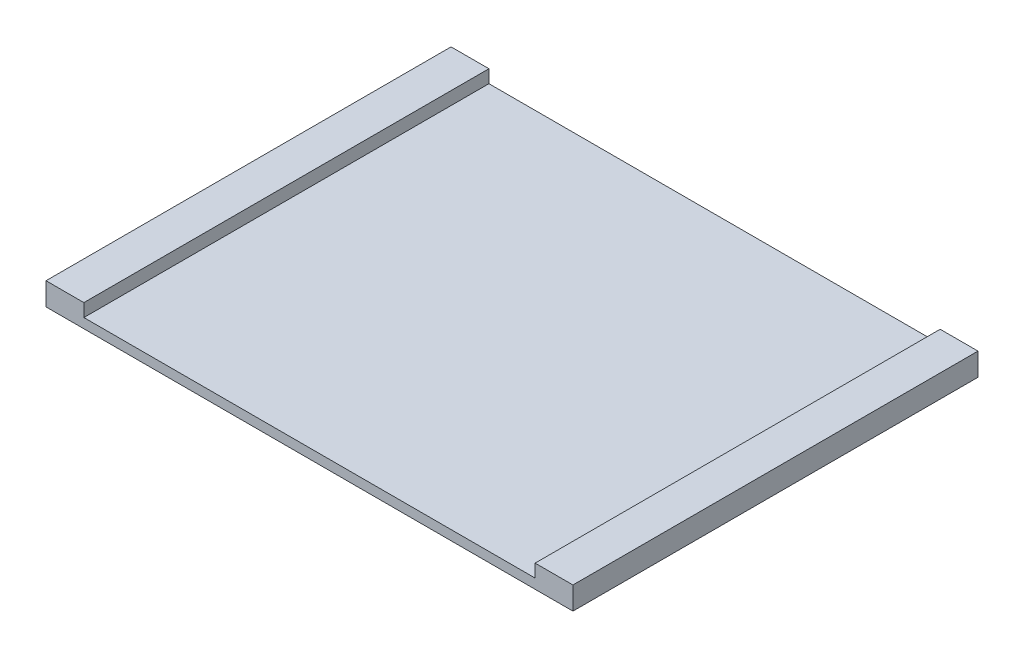
ISO-10303-21;
HEADER;
FILE_DESCRIPTION(('STEP AP214'),'2;1');
FILE_NAME('part.step','',(''),(''),'','','');
FILE_SCHEMA(('AUTOMOTIVE_DESIGN { 1 0 10303 214 1 1 1 1 }'));
ENDSEC;
DATA;
#1=APPLICATION_CONTEXT('core data for automotive mechanical design processes');
#2=APPLICATION_PROTOCOL_DEFINITION('international standard','automotive_design',2000,#1);
#3=PRODUCT_CONTEXT('',#1,'mechanical');
#4=PRODUCT('Part','Part','',(#3));
#5=PRODUCT_RELATED_PRODUCT_CATEGORY('part','',(#4));
#6=PRODUCT_DEFINITION_FORMATION('','',#4);
#7=PRODUCT_DEFINITION_CONTEXT('part definition',#1,'design');
#8=PRODUCT_DEFINITION('design','',#6,#7);
#9=PRODUCT_DEFINITION_SHAPE('','',#8);
#10=(LENGTH_UNIT() NAMED_UNIT(*) SI_UNIT(.MILLI.,.METRE.));
#11=(NAMED_UNIT(*) PLANE_ANGLE_UNIT() SI_UNIT($,.RADIAN.));
#12=(NAMED_UNIT(*) SI_UNIT($,.STERADIAN.) SOLID_ANGLE_UNIT());
#13=UNCERTAINTY_MEASURE_WITH_UNIT(LENGTH_MEASURE(1.E-05),#10,'distance_accuracy_value','');
#14=(GEOMETRIC_REPRESENTATION_CONTEXT(3) GLOBAL_UNCERTAINTY_ASSIGNED_CONTEXT((#13)) GLOBAL_UNIT_ASSIGNED_CONTEXT((#10,
#11,#12)) REPRESENTATION_CONTEXT('',''));
#15=CARTESIAN_POINT('',(0.,0.,0.));
#16=DIRECTION('',(0.,0.,1.));
#17=DIRECTION('',(1.,0.,0.));
#18=AXIS2_PLACEMENT_3D('',#15,#16,#17);
#19=CARTESIAN_POINT('',(0.,4.,0.));
#20=DIRECTION('',(1.,0.,0.));
#21=DIRECTION('',(0.,0.,-1.));
#22=AXIS2_PLACEMENT_3D('',#19,#20,#21);
#23=PLANE('',#22);
#24=DIRECTION('',(0.,0.,1.));
#25=VECTOR('',#24,1.);
#26=CARTESIAN_POINT('',(0.,0.,0.));
#27=LINE('',#26,#25);
#28=CARTESIAN_POINT('',(0.,0.,-50.8));
#29=VERTEX_POINT('',#28);
#30=CARTESIAN_POINT('',(0.,0.,0.));
#31=VERTEX_POINT('',#30);
#32=EDGE_CURVE('E186',#29,#31,#27,.T.);
#33=ORIENTED_EDGE('',*,*,#32,.T.);
#34=DIRECTION('',(0.,-1.,0.));
#35=VECTOR('',#34,1.);
#36=CARTESIAN_POINT('',(0.,4.,0.));
#37=LINE('',#36,#35);
#38=CARTESIAN_POINT('',(0.,4.,0.));
#39=VERTEX_POINT('',#38);
#40=EDGE_CURVE('E216',#39,#31,#37,.T.);
#41=ORIENTED_EDGE('',*,*,#40,.F.);
#42=DIRECTION('',(0.,0.,1.));
#43=VECTOR('',#42,1.);
#44=CARTESIAN_POINT('',(0.,4.,0.));
#45=LINE('',#44,#43);
#46=CARTESIAN_POINT('',(0.,4.,-50.8));
#47=VERTEX_POINT('',#46);
#48=EDGE_CURVE('E187',#47,#39,#45,.T.);
#49=ORIENTED_EDGE('',*,*,#48,.F.);
#50=DIRECTION('',(0.,-1.,0.));
#51=VECTOR('',#50,1.);
#52=CARTESIAN_POINT('',(0.,4.,-50.8));
#53=LINE('',#52,#51);
#54=EDGE_CURVE('E200',#47,#29,#53,.T.);
#55=ORIENTED_EDGE('',*,*,#54,.T.);
#56=EDGE_LOOP('',(#33,#41,#49,#55));
#57=FACE_BOUND('',#56,.T.);
#58=ADVANCED_FACE('F33',(#57),#23,.F.);
#59=CARTESIAN_POINT('',(0.,4.,0.));
#60=DIRECTION('',(0.,0.,-1.));
#61=DIRECTION('',(-1.,0.,0.));
#62=AXIS2_PLACEMENT_3D('',#59,#60,#61);
#63=PLANE('',#62);
#64=DIRECTION('',(1.,0.,0.));
#65=VECTOR('',#64,1.);
#66=CARTESIAN_POINT('',(0.,0.,0.));
#67=LINE('',#66,#65);
#68=CARTESIAN_POINT('',(69.596,0.,0.));
#69=VERTEX_POINT('',#68);
#70=EDGE_CURVE('E203',#31,#69,#67,.T.);
#71=ORIENTED_EDGE('',*,*,#70,.T.);
#72=DIRECTION('',(0.,-1.,0.));
#73=VECTOR('',#72,1.);
#74=CARTESIAN_POINT('',(69.596,4.,0.));
#75=LINE('',#74,#73);
#76=CARTESIAN_POINT('',(69.596,4.,0.));
#77=VERTEX_POINT('',#76);
#78=EDGE_CURVE('E213',#77,#69,#75,.T.);
#79=ORIENTED_EDGE('',*,*,#78,.F.);
#80=DIRECTION('',(1.,0.,0.));
#81=VECTOR('',#80,1.);
#82=CARTESIAN_POINT('',(0.,4.,0.));
#83=LINE('',#82,#81);
#84=EDGE_CURVE('E190',#39,#77,#83,.T.);
#85=ORIENTED_EDGE('',*,*,#84,.F.);
#86=ORIENTED_EDGE('',*,*,#40,.T.);
#87=EDGE_LOOP('',(#71,#79,#85,#86));
#88=FACE_BOUND('',#87,.T.);
#89=ADVANCED_FACE('F252',(#88),#63,.F.);
#90=CARTESIAN_POINT('',(69.596,4.,0.));
#91=DIRECTION('',(-1.,0.,0.));
#92=DIRECTION('',(0.,0.,1.));
#93=AXIS2_PLACEMENT_3D('',#90,#91,#92);
#94=PLANE('',#93);
#95=DIRECTION('',(0.,0.,-1.));
#96=VECTOR('',#95,1.);
#97=CARTESIAN_POINT('',(69.596,0.,0.));
#98=LINE('',#97,#96);
#99=CARTESIAN_POINT('',(69.596,0.,-50.8));
#100=VERTEX_POINT('',#99);
#101=EDGE_CURVE('E205',#69,#100,#98,.T.);
#102=ORIENTED_EDGE('',*,*,#101,.T.);
#103=DIRECTION('',(0.,-1.,0.));
#104=VECTOR('',#103,1.);
#105=CARTESIAN_POINT('',(69.596,4.,-50.8));
#106=LINE('',#105,#104);
#107=CARTESIAN_POINT('',(69.596,4.,-50.8));
#108=VERTEX_POINT('',#107);
#109=EDGE_CURVE('E210',#108,#100,#106,.T.);
#110=ORIENTED_EDGE('',*,*,#109,.F.);
#111=DIRECTION('',(0.,0.,-1.));
#112=VECTOR('',#111,1.);
#113=CARTESIAN_POINT('',(69.596,4.,0.));
#114=LINE('',#113,#112);
#115=EDGE_CURVE('E194',#77,#108,#114,.T.);
#116=ORIENTED_EDGE('',*,*,#115,.F.);
#117=ORIENTED_EDGE('',*,*,#78,.T.);
#118=EDGE_LOOP('',(#102,#110,#116,#117));
#119=FACE_BOUND('',#118,.T.);
#120=ADVANCED_FACE('F257',(#119),#94,.F.);
#121=CARTESIAN_POINT('',(0.,4.,-50.8));
#122=DIRECTION('',(0.,0.,1.));
#123=DIRECTION('',(1.,0.,0.));
#124=AXIS2_PLACEMENT_3D('',#121,#122,#123);
#125=PLANE('',#124);
#126=DIRECTION('',(-1.,0.,0.));
#127=VECTOR('',#126,1.);
#128=CARTESIAN_POINT('',(0.,0.,-50.8));
#129=LINE('',#128,#127);
#130=EDGE_CURVE('E191',#100,#29,#129,.T.);
#131=ORIENTED_EDGE('',*,*,#130,.T.);
#132=ORIENTED_EDGE('',*,*,#54,.F.);
#133=DIRECTION('',(-1.,0.,0.));
#134=VECTOR('',#133,1.);
#135=CARTESIAN_POINT('',(0.,4.,-50.8));
#136=LINE('',#135,#134);
#137=EDGE_CURVE('E197',#108,#47,#136,.T.);
#138=ORIENTED_EDGE('',*,*,#137,.F.);
#139=ORIENTED_EDGE('',*,*,#109,.T.);
#140=EDGE_LOOP('',(#131,#132,#138,#139));
#141=FACE_BOUND('',#140,.T.);
#142=ADVANCED_FACE('F246',(#141),#125,.F.);
#143=CARTESIAN_POINT('',(0.,0.,0.));
#144=DIRECTION('',(0.,-1.,0.));
#145=DIRECTION('',(0.,0.,-1.));
#146=AXIS2_PLACEMENT_3D('',#143,#144,#145);
#147=PLANE('',#146);
#148=ORIENTED_EDGE('',*,*,#32,.F.);
#149=ORIENTED_EDGE('',*,*,#130,.F.);
#150=ORIENTED_EDGE('',*,*,#101,.F.);
#151=ORIENTED_EDGE('',*,*,#70,.F.);
#152=EDGE_LOOP('',(#148,#149,#150,#151));
#153=FACE_BOUND('',#152,.T.);
#154=ADVANCED_FACE('F238',(#153),#147,.T.);
#155=CARTESIAN_POINT('',(0.,4.,0.));
#156=DIRECTION('',(0.,1.,0.));
#157=DIRECTION('',(0.,0.,1.));
#158=AXIS2_PLACEMENT_3D('',#155,#156,#157);
#159=PLANE('',#158);
#160=ORIENTED_EDGE('',*,*,#48,.T.);
#161=ORIENTED_EDGE('',*,*,#84,.T.);
#162=ORIENTED_EDGE('',*,*,#115,.T.);
#163=ORIENTED_EDGE('',*,*,#137,.T.);
#164=EDGE_LOOP('',(#160,#161,#162,#163));
#165=FACE_BOUND('',#164,.T.);
#166=DIRECTION('',(0.,0.,1.));
#167=VECTOR('',#166,1.);
#168=CARTESIAN_POINT('',(-5.84200000000001,4.,-56.638));
#169=LINE('',#168,#167);
#170=CARTESIAN_POINT('',(-5.84200000000001,4.,-56.638));
#171=VERTEX_POINT('',#170);
#172=CARTESIAN_POINT('',(-5.842,4.,5.842));
#173=VERTEX_POINT('',#172);
#174=EDGE_CURVE('E168',#171,#173,#169,.T.);
#175=ORIENTED_EDGE('',*,*,#174,.F.);
#176=DIRECTION('',(-1.,0.,0.));
#177=VECTOR('',#176,1.);
#178=CARTESIAN_POINT('',(-5.84200000000001,4.,-56.638));
#179=LINE('',#178,#177);
#180=CARTESIAN_POINT('',(75.438,4.,-56.638));
#181=VERTEX_POINT('',#180);
#182=EDGE_CURVE('E173',#181,#171,#179,.T.);
#183=ORIENTED_EDGE('',*,*,#182,.F.);
#184=DIRECTION('',(0.,0.,-1.));
#185=VECTOR('',#184,1.);
#186=CARTESIAN_POINT('',(75.438,4.,-56.638));
#187=LINE('',#186,#185);
#188=CARTESIAN_POINT('',(75.438,4.,5.842));
#189=VERTEX_POINT('',#188);
#190=EDGE_CURVE('E179',#189,#181,#187,.T.);
#191=ORIENTED_EDGE('',*,*,#190,.F.);
#192=DIRECTION('',(1.,0.,0.));
#193=VECTOR('',#192,1.);
#194=CARTESIAN_POINT('',(-5.842,4.,5.842));
#195=LINE('',#194,#193);
#196=EDGE_CURVE('E123',#173,#189,#195,.T.);
#197=ORIENTED_EDGE('',*,*,#196,.F.);
#198=EDGE_LOOP('',(#175,#183,#191,#197));
#199=FACE_BOUND('',#198,.T.);
#200=ADVANCED_FACE('F236',(#165,#199),#159,.F.);
#201=CARTESIAN_POINT('',(-5.84200000000001,5.5,-56.638));
#202=DIRECTION('',(1.,0.,0.));
#203=DIRECTION('',(0.,0.,-1.));
#204=AXIS2_PLACEMENT_3D('',#201,#202,#203);
#205=PLANE('',#204);
#206=ORIENTED_EDGE('',*,*,#174,.T.);
#207=DIRECTION('',(0.,-1.,0.));
#208=VECTOR('',#207,1.);
#209=CARTESIAN_POINT('',(-5.842,5.5,5.842));
#210=LINE('',#209,#208);
#211=CARTESIAN_POINT('',(-5.842,7.5,5.842));
#212=VERTEX_POINT('',#211);
#213=EDGE_CURVE('E127',#212,#173,#210,.T.);
#214=ORIENTED_EDGE('',*,*,#213,.F.);
#215=DIRECTION('',(0.,0.,-1.));
#216=VECTOR('',#215,1.);
#217=CARTESIAN_POINT('',(-5.842,7.5,5.842));
#218=LINE('',#217,#216);
#219=CARTESIAN_POINT('',(-5.842,7.5,-56.638));
#220=VERTEX_POINT('',#219);
#221=EDGE_CURVE('E151',#212,#220,#218,.T.);
#222=ORIENTED_EDGE('',*,*,#221,.T.);
#223=DIRECTION('',(0.,-1.,0.));
#224=VECTOR('',#223,1.);
#225=CARTESIAN_POINT('',(-5.84200000000001,5.5,-56.638));
#226=LINE('',#225,#224);
#227=EDGE_CURVE('E175',#220,#171,#226,.T.);
#228=ORIENTED_EDGE('',*,*,#227,.T.);
#229=EDGE_LOOP('',(#206,#214,#222,#228));
#230=FACE_BOUND('',#229,.T.);
#231=ADVANCED_FACE('F230',(#230),#205,.F.);
#232=CARTESIAN_POINT('',(-5.842,5.5,5.842));
#233=DIRECTION('',(0.,0.,-1.));
#234=DIRECTION('',(-1.,0.,0.));
#235=AXIS2_PLACEMENT_3D('',#232,#233,#234);
#236=PLANE('',#235);
#237=ORIENTED_EDGE('',*,*,#196,.T.);
#238=DIRECTION('',(0.,-1.,0.));
#239=VECTOR('',#238,1.);
#240=CARTESIAN_POINT('',(75.438,5.5,5.842));
#241=LINE('',#240,#239);
#242=CARTESIAN_POINT('',(75.438,7.5,5.842));
#243=VERTEX_POINT('',#242);
#244=EDGE_CURVE('E117',#243,#189,#241,.T.);
#245=ORIENTED_EDGE('',*,*,#244,.F.);
#246=DIRECTION('',(-1.,0.,0.));
#247=VECTOR('',#246,1.);
#248=CARTESIAN_POINT('',(75.438,7.5,5.842));
#249=LINE('',#248,#247);
#250=CARTESIAN_POINT('',(69.6035899936182,7.5,5.842));
#251=VERTEX_POINT('',#250);
#252=EDGE_CURVE('E121',#243,#251,#249,.T.);
#253=ORIENTED_EDGE('',*,*,#252,.T.);
#254=DIRECTION('',(0.,-1.,0.));
#255=VECTOR('',#254,1.);
#256=CARTESIAN_POINT('',(69.6035899936182,7.5,5.842));
#257=LINE('',#256,#255);
#258=CARTESIAN_POINT('',(69.6035899936182,5.5,5.842));
#259=VERTEX_POINT('',#258);
#260=EDGE_CURVE('E147',#251,#259,#257,.T.);
#261=ORIENTED_EDGE('',*,*,#260,.T.);
#262=DIRECTION('',(1.,0.,0.));
#263=VECTOR('',#262,1.);
#264=CARTESIAN_POINT('',(-5.842,5.5,5.842));
#265=LINE('',#264,#263);
#266=CARTESIAN_POINT('',(0.,5.5,5.842));
#267=VERTEX_POINT('',#266);
#268=EDGE_CURVE('E50',#267,#259,#265,.T.);
#269=ORIENTED_EDGE('',*,*,#268,.F.);
#270=DIRECTION('',(0.,-1.,0.));
#271=VECTOR('',#270,1.);
#272=CARTESIAN_POINT('',(0.,7.5,5.842));
#273=LINE('',#272,#271);
#274=CARTESIAN_POINT('',(0.,7.5,5.842));
#275=VERTEX_POINT('',#274);
#276=EDGE_CURVE('E165',#275,#267,#273,.T.);
#277=ORIENTED_EDGE('',*,*,#276,.F.);
#278=DIRECTION('',(-1.,0.,0.));
#279=VECTOR('',#278,1.);
#280=CARTESIAN_POINT('',(-5.842,7.5,5.842));
#281=LINE('',#280,#279);
#282=EDGE_CURVE('E161',#275,#212,#281,.T.);
#283=ORIENTED_EDGE('',*,*,#282,.T.);
#284=ORIENTED_EDGE('',*,*,#213,.T.);
#285=EDGE_LOOP('',(#237,#245,#253,#261,#269,#277,#283,#284));
#286=FACE_BOUND('',#285,.T.);
#287=ADVANCED_FACE('F119',(#286),#236,.F.);
#288=CARTESIAN_POINT('',(75.438,5.5,-56.638));
#289=DIRECTION('',(-1.,0.,0.));
#290=DIRECTION('',(0.,0.,1.));
#291=AXIS2_PLACEMENT_3D('',#288,#289,#290);
#292=PLANE('',#291);
#293=ORIENTED_EDGE('',*,*,#190,.T.);
#294=DIRECTION('',(0.,-1.,0.));
#295=VECTOR('',#294,1.);
#296=CARTESIAN_POINT('',(75.438,5.5,-56.638));
#297=LINE('',#296,#295);
#298=CARTESIAN_POINT('',(75.438,7.5,-56.638));
#299=VERTEX_POINT('',#298);
#300=EDGE_CURVE('E128',#299,#181,#297,.T.);
#301=ORIENTED_EDGE('',*,*,#300,.F.);
#302=DIRECTION('',(0.,0.,1.));
#303=VECTOR('',#302,1.);
#304=CARTESIAN_POINT('',(75.438,7.5,5.842));
#305=LINE('',#304,#303);
#306=EDGE_CURVE('E135',#299,#243,#305,.T.);
#307=ORIENTED_EDGE('',*,*,#306,.T.);
#308=ORIENTED_EDGE('',*,*,#244,.T.);
#309=EDGE_LOOP('',(#293,#301,#307,#308));
#310=FACE_BOUND('',#309,.T.);
#311=ADVANCED_FACE('F140',(#310),#292,.F.);
#312=CARTESIAN_POINT('',(-5.84200000000001,5.5,-56.638));
#313=DIRECTION('',(0.,0.,1.));
#314=DIRECTION('',(1.,0.,0.));
#315=AXIS2_PLACEMENT_3D('',#312,#313,#314);
#316=PLANE('',#315);
#317=DIRECTION('',(-1.,0.,0.));
#318=VECTOR('',#317,1.);
#319=CARTESIAN_POINT('',(-5.84200000000001,5.5,-56.638));
#320=LINE('',#319,#318);
#321=CARTESIAN_POINT('',(69.6035899936182,5.5,-56.638));
#322=VERTEX_POINT('',#321);
#323=CARTESIAN_POINT('',(0.,5.5,-56.638));
#324=VERTEX_POINT('',#323);
#325=EDGE_CURVE('E172',#322,#324,#320,.T.);
#326=ORIENTED_EDGE('',*,*,#325,.F.);
#327=DIRECTION('',(0.,-1.,0.));
#328=VECTOR('',#327,1.);
#329=CARTESIAN_POINT('',(69.6035899936182,7.5,-56.638));
#330=LINE('',#329,#328);
#331=CARTESIAN_POINT('',(69.6035899936182,7.5,-56.638));
#332=VERTEX_POINT('',#331);
#333=EDGE_CURVE('E148',#332,#322,#330,.T.);
#334=ORIENTED_EDGE('',*,*,#333,.F.);
#335=DIRECTION('',(1.,0.,0.));
#336=VECTOR('',#335,1.);
#337=CARTESIAN_POINT('',(75.438,7.5,-56.638));
#338=LINE('',#337,#336);
#339=EDGE_CURVE('E145',#332,#299,#338,.T.);
#340=ORIENTED_EDGE('',*,*,#339,.T.);
#341=ORIENTED_EDGE('',*,*,#300,.T.);
#342=ORIENTED_EDGE('',*,*,#182,.T.);
#343=ORIENTED_EDGE('',*,*,#227,.F.);
#344=DIRECTION('',(1.,0.,0.));
#345=VECTOR('',#344,1.);
#346=CARTESIAN_POINT('',(-5.842,7.5,-56.638));
#347=LINE('',#346,#345);
#348=CARTESIAN_POINT('',(0.,7.5,-56.638));
#349=VERTEX_POINT('',#348);
#350=EDGE_CURVE('E155',#220,#349,#347,.T.);
#351=ORIENTED_EDGE('',*,*,#350,.T.);
#352=DIRECTION('',(0.,-1.,0.));
#353=VECTOR('',#352,1.);
#354=CARTESIAN_POINT('',(0.,7.5,-56.638));
#355=LINE('',#354,#353);
#356=EDGE_CURVE('E164',#349,#324,#355,.T.);
#357=ORIENTED_EDGE('',*,*,#356,.T.);
#358=EDGE_LOOP('',(#326,#334,#340,#341,#342,#343,#351,#357));
#359=FACE_BOUND('',#358,.T.);
#360=ADVANCED_FACE('F223',(#359),#316,.F.);
#361=CARTESIAN_POINT('',(0.,5.5,0.));
#362=DIRECTION('',(0.,1.,0.));
#363=DIRECTION('',(0.,0.,1.));
#364=AXIS2_PLACEMENT_3D('',#361,#362,#363);
#365=PLANE('',#364);
#366=DIRECTION('',(0.,0.,1.));
#367=VECTOR('',#366,1.);
#368=CARTESIAN_POINT('',(69.6035899936182,5.5,0.));
#369=LINE('',#368,#367);
#370=EDGE_CURVE('E11',#322,#259,#369,.T.);
#371=ORIENTED_EDGE('',*,*,#370,.F.);
#372=ORIENTED_EDGE('',*,*,#325,.T.);
#373=DIRECTION('',(0.,0.,-1.));
#374=VECTOR('',#373,1.);
#375=CARTESIAN_POINT('',(0.,5.5,0.));
#376=LINE('',#375,#374);
#377=EDGE_CURVE('E40',#267,#324,#376,.T.);
#378=ORIENTED_EDGE('',*,*,#377,.F.);
#379=ORIENTED_EDGE('',*,*,#268,.T.);
#380=EDGE_LOOP('',(#371,#372,#378,#379));
#381=FACE_BOUND('',#380,.T.);
#382=ADVANCED_FACE('F279',(#381),#365,.T.);
#383=CARTESIAN_POINT('',(0.,7.5,5.842));
#384=DIRECTION('',(1.,0.,0.));
#385=DIRECTION('',(0.,0.,-1.));
#386=AXIS2_PLACEMENT_3D('',#383,#384,#385);
#387=PLANE('',#386);
#388=ORIENTED_EDGE('',*,*,#276,.T.);
#389=ORIENTED_EDGE('',*,*,#377,.T.);
#390=ORIENTED_EDGE('',*,*,#356,.F.);
#391=DIRECTION('',(0.,0.,1.));
#392=VECTOR('',#391,1.);
#393=CARTESIAN_POINT('',(0.,7.5,5.842));
#394=LINE('',#393,#392);
#395=EDGE_CURVE('E158',#349,#275,#394,.T.);
#396=ORIENTED_EDGE('',*,*,#395,.T.);
#397=EDGE_LOOP('',(#388,#389,#390,#396));
#398=FACE_BOUND('',#397,.T.);
#399=ADVANCED_FACE('F220',(#398),#387,.T.);
#400=CARTESIAN_POINT('',(0.,7.5,0.));
#401=DIRECTION('',(0.,-1.,0.));
#402=DIRECTION('',(0.,0.,-1.));
#403=AXIS2_PLACEMENT_3D('',#400,#401,#402);
#404=PLANE('',#403);
#405=ORIENTED_EDGE('',*,*,#221,.F.);
#406=ORIENTED_EDGE('',*,*,#282,.F.);
#407=ORIENTED_EDGE('',*,*,#395,.F.);
#408=ORIENTED_EDGE('',*,*,#350,.F.);
#409=EDGE_LOOP('',(#405,#406,#407,#408));
#410=FACE_BOUND('',#409,.T.);
#411=ADVANCED_FACE('F227',(#410),#404,.F.);
#412=CARTESIAN_POINT('',(69.6035899936182,7.5,5.842));
#413=DIRECTION('',(-1.,0.,0.));
#414=DIRECTION('',(0.,0.,1.));
#415=AXIS2_PLACEMENT_3D('',#412,#413,#414);
#416=PLANE('',#415);
#417=ORIENTED_EDGE('',*,*,#333,.T.);
#418=ORIENTED_EDGE('',*,*,#370,.T.);
#419=ORIENTED_EDGE('',*,*,#260,.F.);
#420=DIRECTION('',(0.,0.,-1.));
#421=VECTOR('',#420,1.);
#422=CARTESIAN_POINT('',(69.6035899936182,7.5,5.842));
#423=LINE('',#422,#421);
#424=EDGE_CURVE('E138',#251,#332,#423,.T.);
#425=ORIENTED_EDGE('',*,*,#424,.T.);
#426=EDGE_LOOP('',(#417,#418,#419,#425));
#427=FACE_BOUND('',#426,.T.);
#428=ADVANCED_FACE('F233',(#427),#416,.T.);
#429=CARTESIAN_POINT('',(0.,7.5,0.));
#430=DIRECTION('',(0.,1.,0.));
#431=DIRECTION('',(0.,0.,1.));
#432=AXIS2_PLACEMENT_3D('',#429,#430,#431);
#433=PLANE('',#432);
#434=ORIENTED_EDGE('',*,*,#306,.F.);
#435=ORIENTED_EDGE('',*,*,#339,.F.);
#436=ORIENTED_EDGE('',*,*,#424,.F.);
#437=ORIENTED_EDGE('',*,*,#252,.F.);
#438=EDGE_LOOP('',(#434,#435,#436,#437));
#439=FACE_BOUND('',#438,.T.);
#440=ADVANCED_FACE('F133',(#439),#433,.T.);
#441=CLOSED_SHELL('',(#58,#89,#120,#142,#154,#200,#231,#287,#311,#360,#382,#399,#411,#428,#440));
#442=MANIFOLD_SOLID_BREP('B2',#441);
#443=ADVANCED_BREP_SHAPE_REPRESENTATION('',(#18,#442),#14);
#444=SHAPE_DEFINITION_REPRESENTATION(#9,#443);
ENDSEC;
END-ISO-10303-21;
